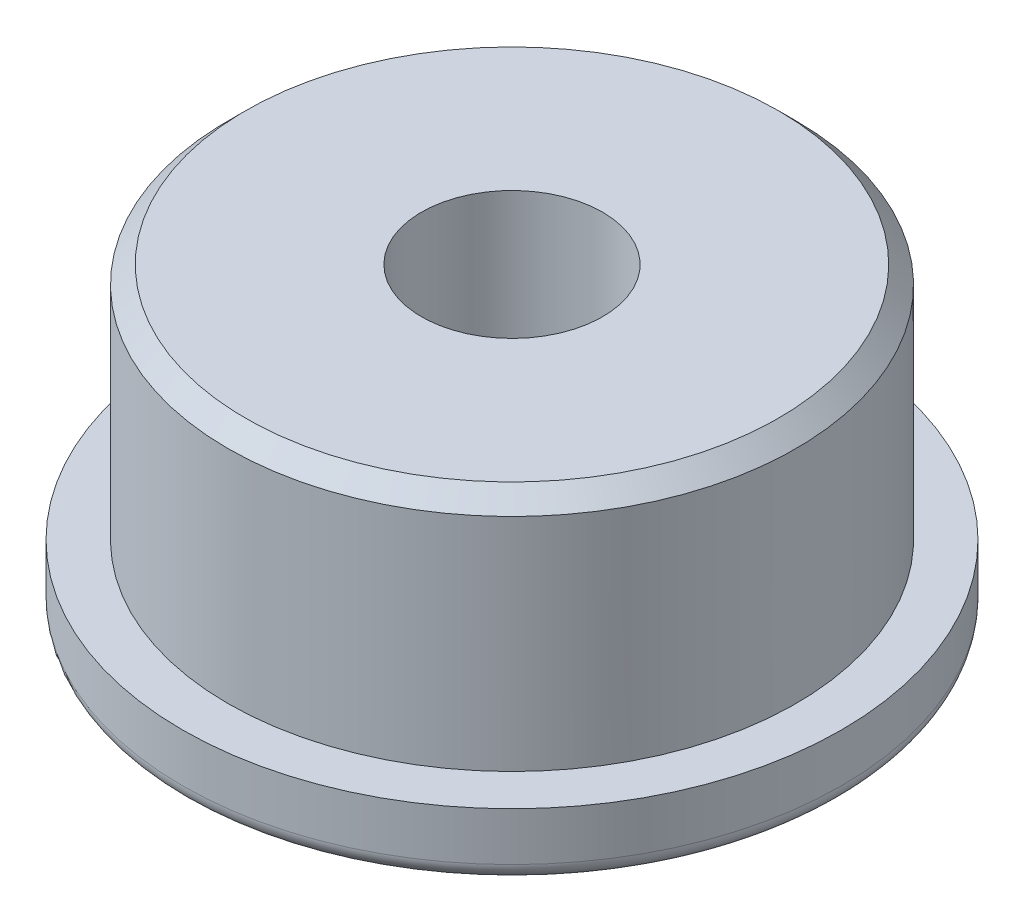
ISO-10303-21;
HEADER;
FILE_DESCRIPTION(('STEP AP214'),'2;1');
FILE_NAME('part.step','',(''),(''),'','','');
FILE_SCHEMA(('AUTOMOTIVE_DESIGN { 1 0 10303 214 1 1 1 1 }'));
ENDSEC;
DATA;
#1=APPLICATION_CONTEXT('core data for automotive mechanical design processes');
#2=APPLICATION_PROTOCOL_DEFINITION('international standard','automotive_design',2000,#1);
#3=PRODUCT_CONTEXT('',#1,'mechanical');
#4=PRODUCT('Part','Part','',(#3));
#5=PRODUCT_RELATED_PRODUCT_CATEGORY('part','',(#4));
#6=PRODUCT_DEFINITION_FORMATION('','',#4);
#7=PRODUCT_DEFINITION_CONTEXT('part definition',#1,'design');
#8=PRODUCT_DEFINITION('design','',#6,#7);
#9=PRODUCT_DEFINITION_SHAPE('','',#8);
#10=(LENGTH_UNIT() NAMED_UNIT(*) SI_UNIT(.MILLI.,.METRE.));
#11=(NAMED_UNIT(*) PLANE_ANGLE_UNIT() SI_UNIT($,.RADIAN.));
#12=(NAMED_UNIT(*) SI_UNIT($,.STERADIAN.) SOLID_ANGLE_UNIT());
#13=UNCERTAINTY_MEASURE_WITH_UNIT(LENGTH_MEASURE(1.E-05),#10,'distance_accuracy_value','');
#14=(GEOMETRIC_REPRESENTATION_CONTEXT(3) GLOBAL_UNCERTAINTY_ASSIGNED_CONTEXT((#13)) GLOBAL_UNIT_ASSIGNED_CONTEXT((#10,
#11,#12)) REPRESENTATION_CONTEXT('',''));
#15=CARTESIAN_POINT('',(0.,0.,0.));
#16=DIRECTION('',(0.,0.,1.));
#17=DIRECTION('',(1.,0.,0.));
#18=AXIS2_PLACEMENT_3D('',#15,#16,#17);
#19=CARTESIAN_POINT('',(0.,1.27,0.));
#20=DIRECTION('',(0.,1.,0.));
#21=DIRECTION('',(0.999922084299473,0.,-0.0124830016501797));
#22=AXIS2_PLACEMENT_3D('',#19,#20,#21);
#23=TOROIDAL_SURFACE('',#22,11.3538,1.27);
#24=CARTESIAN_POINT('',(0.,1.27,0.));
#25=DIRECTION('',(0.,1.,0.));
#26=DIRECTION('',(0.,0.,1.));
#27=AXIS2_PLACEMENT_3D('',#24,#25,#26);
#28=CIRCLE('',#27,12.6238);
#29=CARTESIAN_POINT('',(0.,1.27,12.6238));
#30=VERTEX_POINT('',#29);
#31=EDGE_CURVE('E55',#30,#30,#28,.T.);
#32=ORIENTED_EDGE('',*,*,#31,.F.);
#33=EDGE_LOOP('',(#32));
#34=FACE_BOUND('',#33,.T.);
#35=CARTESIAN_POINT('',(0.,0.,0.));
#36=DIRECTION('',(0.,1.,0.));
#37=DIRECTION('',(-1.,0.,0.));
#38=AXIS2_PLACEMENT_3D('',#35,#36,#37);
#39=CIRCLE('',#38,11.3538);
#40=CARTESIAN_POINT('',(-11.3538,0.,0.));
#41=VERTEX_POINT('',#40);
#42=EDGE_CURVE('E51',#41,#41,#39,.T.);
#43=ORIENTED_EDGE('',*,*,#42,.T.);
#44=EDGE_LOOP('',(#43));
#45=FACE_BOUND('',#44,.T.);
#46=ADVANCED_FACE('F15',(#34,#45),#23,.T.);
#47=CARTESIAN_POINT('',(0.,0.,0.));
#48=DIRECTION('',(0.,1.,0.));
#49=DIRECTION('',(0.,0.,1.));
#50=AXIS2_PLACEMENT_3D('',#47,#48,#49);
#51=CYLINDRICAL_SURFACE('',#50,12.6238);
#52=CARTESIAN_POINT('',(0.,3.302,0.));
#53=DIRECTION('',(0.,1.,0.));
#54=DIRECTION('',(0.,0.,1.));
#55=AXIS2_PLACEMENT_3D('',#52,#53,#54);
#56=CIRCLE('',#55,12.6238);
#57=CARTESIAN_POINT('',(0.,3.302,12.6238));
#58=VERTEX_POINT('',#57);
#59=EDGE_CURVE('E20',#58,#58,#56,.F.);
#60=ORIENTED_EDGE('',*,*,#59,.T.);
#61=EDGE_LOOP('',(#60));
#62=FACE_BOUND('',#61,.T.);
#63=ORIENTED_EDGE('',*,*,#31,.T.);
#64=EDGE_LOOP('',(#63));
#65=FACE_BOUND('',#64,.T.);
#66=ADVANCED_FACE('F81',(#62,#65),#51,.T.);
#67=CARTESIAN_POINT('',(0.,0.,0.));
#68=DIRECTION('',(0.,1.,0.));
#69=DIRECTION('',(0.,0.,1.));
#70=AXIS2_PLACEMENT_3D('',#67,#68,#69);
#71=PLANE('',#70);
#72=CARTESIAN_POINT('',(0.,0.,0.));
#73=DIRECTION('',(0.,-1.,0.));
#74=DIRECTION('',(0.,0.,-1.));
#75=AXIS2_PLACEMENT_3D('',#72,#73,#74);
#76=CIRCLE('',#75,6.5659);
#77=CARTESIAN_POINT('',(0.,0.,-6.5659));
#78=VERTEX_POINT('',#77);
#79=EDGE_CURVE('E45',#78,#78,#76,.F.);
#80=ORIENTED_EDGE('',*,*,#79,.T.);
#81=EDGE_LOOP('',(#80));
#82=FACE_BOUND('',#81,.T.);
#83=ORIENTED_EDGE('',*,*,#42,.F.);
#84=EDGE_LOOP('',(#83));
#85=FACE_BOUND('',#84,.T.);
#86=ADVANCED_FACE('F71',(#82,#85),#71,.F.);
#87=CARTESIAN_POINT('',(0.,3.302,0.));
#88=DIRECTION('',(0.,1.,0.));
#89=DIRECTION('',(0.,0.,1.));
#90=AXIS2_PLACEMENT_3D('',#87,#88,#89);
#91=PLANE('',#90);
#92=ORIENTED_EDGE('',*,*,#59,.F.);
#93=EDGE_LOOP('',(#92));
#94=FACE_BOUND('',#93,.T.);
#95=CARTESIAN_POINT('',(0.,3.302,0.));
#96=DIRECTION('',(0.,1.,0.));
#97=DIRECTION('',(0.,0.,-1.));
#98=AXIS2_PLACEMENT_3D('',#95,#96,#97);
#99=CIRCLE('',#98,22.606);
#100=CARTESIAN_POINT('',(0.,3.302,-22.606));
#101=VERTEX_POINT('',#100);
#102=EDGE_CURVE('E44',#101,#101,#99,.T.);
#103=ORIENTED_EDGE('',*,*,#102,.F.);
#104=EDGE_LOOP('',(#103));
#105=FACE_BOUND('',#104,.T.);
#106=ADVANCED_FACE('F80',(#94,#105),#91,.F.);
#107=CARTESIAN_POINT('',(0.,0.,0.));
#108=DIRECTION('',(0.,-1.,0.));
#109=DIRECTION('',(0.,0.,-1.));
#110=AXIS2_PLACEMENT_3D('',#107,#108,#109);
#111=CYLINDRICAL_SURFACE('',#110,6.5659);
#112=CARTESIAN_POINT('',(0.,25.3492,0.));
#113=DIRECTION('',(0.,-1.,0.));
#114=DIRECTION('',(0.,0.,-1.));
#115=AXIS2_PLACEMENT_3D('',#112,#113,#114);
#116=CIRCLE('',#115,6.5659);
#117=CARTESIAN_POINT('',(0.,25.3492,-6.5659));
#118=VERTEX_POINT('',#117);
#119=EDGE_CURVE('E42',#118,#118,#116,.T.);
#120=ORIENTED_EDGE('',*,*,#119,.F.);
#121=EDGE_LOOP('',(#120));
#122=FACE_BOUND('',#121,.T.);
#123=ORIENTED_EDGE('',*,*,#79,.F.);
#124=EDGE_LOOP('',(#123));
#125=FACE_BOUND('',#124,.T.);
#126=ADVANCED_FACE('F117',(#122,#125),#111,.F.);
#127=CARTESIAN_POINT('',(0.,4.572,0.));
#128=DIRECTION('',(0.,1.,0.));
#129=DIRECTION('',(0.00660017862829215,0.,0.999978218583822));
#130=AXIS2_PLACEMENT_3D('',#127,#128,#129);
#131=TOROIDAL_SURFACE('',#130,22.606,1.27);
#132=CARTESIAN_POINT('',(0.,4.572,0.));
#133=DIRECTION('',(0.,1.,0.));
#134=DIRECTION('',(0.,0.,1.));
#135=AXIS2_PLACEMENT_3D('',#132,#133,#134);
#136=CIRCLE('',#135,23.876);
#137=CARTESIAN_POINT('',(0.,4.572,23.876));
#138=VERTEX_POINT('',#137);
#139=EDGE_CURVE('E41',#138,#138,#136,.T.);
#140=ORIENTED_EDGE('',*,*,#139,.F.);
#141=EDGE_LOOP('',(#140));
#142=FACE_BOUND('',#141,.T.);
#143=ORIENTED_EDGE('',*,*,#102,.T.);
#144=EDGE_LOOP('',(#143));
#145=FACE_BOUND('',#144,.T.);
#146=ADVANCED_FACE('F112',(#142,#145),#131,.T.);
#147=CARTESIAN_POINT('',(0.,25.3492,0.));
#148=DIRECTION('',(0.,1.,0.));
#149=DIRECTION('',(0.,0.,1.));
#150=AXIS2_PLACEMENT_3D('',#147,#148,#149);
#151=PLANE('',#150);
#152=ORIENTED_EDGE('',*,*,#119,.T.);
#153=EDGE_LOOP('',(#152));
#154=FACE_BOUND('',#153,.T.);
#155=CARTESIAN_POINT('',(0.,25.3491999999984,0.));
#156=DIRECTION('',(0.,-1.,0.));
#157=DIRECTION('',(0.,0.,-1.));
#158=AXIS2_PLACEMENT_3D('',#155,#156,#157);
#159=CIRCLE('',#158,19.3039999999984);
#160=CARTESIAN_POINT('',(0.,25.3491999999984,-19.3039999999984));
#161=VERTEX_POINT('',#160);
#162=EDGE_CURVE('E38',#161,#161,#159,.T.);
#163=ORIENTED_EDGE('',*,*,#162,.F.);
#164=EDGE_LOOP('',(#163));
#165=FACE_BOUND('',#164,.T.);
#166=ADVANCED_FACE('F108',(#154,#165),#151,.T.);
#167=CARTESIAN_POINT('',(0.,3.302,0.));
#168=DIRECTION('',(0.,1.,0.));
#169=DIRECTION('',(0.,0.,1.));
#170=AXIS2_PLACEMENT_3D('',#167,#168,#169);
#171=CYLINDRICAL_SURFACE('',#170,23.876);
#172=CARTESIAN_POINT('',(0.,8.0772,0.));
#173=DIRECTION('',(0.,1.,0.));
#174=DIRECTION('',(0.,0.,1.));
#175=AXIS2_PLACEMENT_3D('',#172,#173,#174);
#176=CIRCLE('',#175,23.876);
#177=CARTESIAN_POINT('',(0.,8.0772,23.876));
#178=VERTEX_POINT('',#177);
#179=EDGE_CURVE('E29',#178,#178,#176,.T.);
#180=ORIENTED_EDGE('',*,*,#179,.F.);
#181=EDGE_LOOP('',(#180));
#182=FACE_BOUND('',#181,.T.);
#183=ORIENTED_EDGE('',*,*,#139,.T.);
#184=EDGE_LOOP('',(#183));
#185=FACE_BOUND('',#184,.T.);
#186=ADVANCED_FACE('F104',(#182,#185),#171,.T.);
#187=CARTESIAN_POINT('',(0.,24.0792000000016,0.));
#188=DIRECTION('',(0.,-1.,0.));
#189=DIRECTION('',(0.,0.,-1.));
#190=AXIS2_PLACEMENT_3D('',#187,#188,#189);
#191=CONICAL_SURFACE('',#190,20.5740000000016,0.785398163400001);
#192=CARTESIAN_POINT('',(0.,24.0792,0.));
#193=DIRECTION('',(0.,1.,0.));
#194=DIRECTION('',(0.,0.,1.));
#195=AXIS2_PLACEMENT_3D('',#192,#193,#194);
#196=CIRCLE('',#195,20.574);
#197=CARTESIAN_POINT('',(0.,24.0792,20.574));
#198=VERTEX_POINT('',#197);
#199=EDGE_CURVE('E24',#198,#198,#196,.F.);
#200=ORIENTED_EDGE('',*,*,#199,.F.);
#201=EDGE_LOOP('',(#200));
#202=FACE_BOUND('',#201,.T.);
#203=ORIENTED_EDGE('',*,*,#162,.T.);
#204=EDGE_LOOP('',(#203));
#205=FACE_BOUND('',#204,.T.);
#206=ADVANCED_FACE('F97',(#202,#205),#191,.T.);
#207=CARTESIAN_POINT('',(0.,8.0772,0.));
#208=DIRECTION('',(0.,1.,0.));
#209=DIRECTION('',(0.,0.,1.));
#210=AXIS2_PLACEMENT_3D('',#207,#208,#209);
#211=PLANE('',#210);
#212=CARTESIAN_POINT('',(0.,8.0772,0.));
#213=DIRECTION('',(0.,1.,0.));
#214=DIRECTION('',(0.,0.,1.));
#215=AXIS2_PLACEMENT_3D('',#212,#213,#214);
#216=CIRCLE('',#215,20.574);
#217=CARTESIAN_POINT('',(0.,8.0772,20.574));
#218=VERTEX_POINT('',#217);
#219=EDGE_CURVE('E10',#218,#218,#216,.T.);
#220=ORIENTED_EDGE('',*,*,#219,.F.);
#221=EDGE_LOOP('',(#220));
#222=FACE_BOUND('',#221,.T.);
#223=ORIENTED_EDGE('',*,*,#179,.T.);
#224=EDGE_LOOP('',(#223));
#225=FACE_BOUND('',#224,.T.);
#226=ADVANCED_FACE('F92',(#222,#225),#211,.T.);
#227=CARTESIAN_POINT('',(0.,8.0772,0.));
#228=DIRECTION('',(0.,1.,0.));
#229=DIRECTION('',(0.,0.,1.));
#230=AXIS2_PLACEMENT_3D('',#227,#228,#229);
#231=CYLINDRICAL_SURFACE('',#230,20.574);
#232=ORIENTED_EDGE('',*,*,#219,.T.);
#233=EDGE_LOOP('',(#232));
#234=FACE_BOUND('',#233,.T.);
#235=ORIENTED_EDGE('',*,*,#199,.T.);
#236=EDGE_LOOP('',(#235));
#237=FACE_BOUND('',#236,.T.);
#238=ADVANCED_FACE('F90',(#234,#237),#231,.T.);
#239=CLOSED_SHELL('',(#46,#66,#86,#106,#126,#146,#166,#186,#206,#226,#238));
#240=MANIFOLD_SOLID_BREP('B1',#239);
#241=ADVANCED_BREP_SHAPE_REPRESENTATION('',(#18,#240),#14);
#242=SHAPE_DEFINITION_REPRESENTATION(#9,#241);
ENDSEC;
END-ISO-10303-21;
